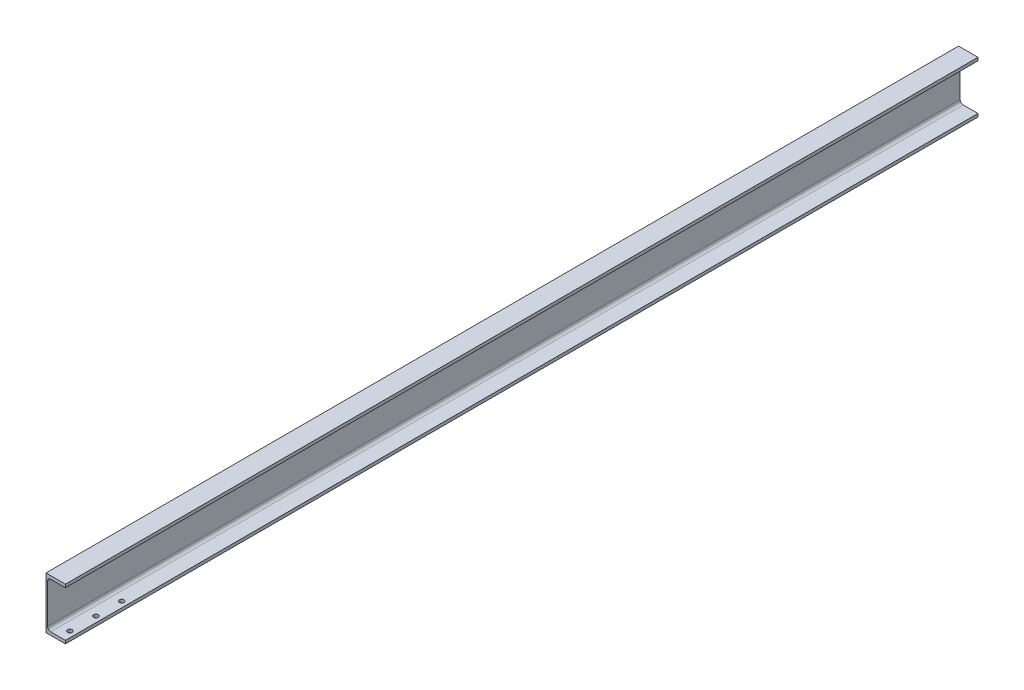
ISO-10303-21;
HEADER;
FILE_DESCRIPTION(('STEP AP214'),'2;1');
FILE_NAME('part.step','',(''),(''),'','','');
FILE_SCHEMA(('AUTOMOTIVE_DESIGN { 1 0 10303 214 1 1 1 1 }'));
ENDSEC;
DATA;
#1=APPLICATION_CONTEXT('core data for automotive mechanical design processes');
#2=APPLICATION_PROTOCOL_DEFINITION('international standard','automotive_design',2000,#1);
#3=PRODUCT_CONTEXT('',#1,'mechanical');
#4=PRODUCT('Part','Part','',(#3));
#5=PRODUCT_RELATED_PRODUCT_CATEGORY('part','',(#4));
#6=PRODUCT_DEFINITION_FORMATION('','',#4);
#7=PRODUCT_DEFINITION_CONTEXT('part definition',#1,'design');
#8=PRODUCT_DEFINITION('design','',#6,#7);
#9=PRODUCT_DEFINITION_SHAPE('','',#8);
#10=(LENGTH_UNIT() NAMED_UNIT(*) SI_UNIT(.MILLI.,.METRE.));
#11=(NAMED_UNIT(*) PLANE_ANGLE_UNIT() SI_UNIT($,.RADIAN.));
#12=(NAMED_UNIT(*) SI_UNIT($,.STERADIAN.) SOLID_ANGLE_UNIT());
#13=UNCERTAINTY_MEASURE_WITH_UNIT(LENGTH_MEASURE(1.E-05),#10,'distance_accuracy_value','');
#14=(GEOMETRIC_REPRESENTATION_CONTEXT(3) GLOBAL_UNCERTAINTY_ASSIGNED_CONTEXT((#13)) GLOBAL_UNIT_ASSIGNED_CONTEXT((#10,
#11,#12)) REPRESENTATION_CONTEXT('',''));
#15=CARTESIAN_POINT('',(0.,0.,0.));
#16=DIRECTION('',(0.,0.,1.));
#17=DIRECTION('',(1.,0.,0.));
#18=AXIS2_PLACEMENT_3D('',#15,#16,#17);
#19=CARTESIAN_POINT('',(0.,-100.,1762.5));
#20=DIRECTION('',(0.,1.,0.));
#21=DIRECTION('',(0.,0.,1.));
#22=AXIS2_PLACEMENT_3D('',#19,#20,#21);
#23=PLANE('',#22);
#24=CARTESIAN_POINT('',(52.5,-100.,1522.5));
#25=DIRECTION('',(0.,-1.,0.));
#26=DIRECTION('',(0.,0.,-1.));
#27=AXIS2_PLACEMENT_3D('',#24,#25,#26);
#28=CIRCLE('',#27,9.00000000000001);
#29=CARTESIAN_POINT('',(52.5,-100.,1513.5));
#30=VERTEX_POINT('',#29);
#31=EDGE_CURVE('E222',#30,#30,#28,.T.);
#32=ORIENTED_EDGE('',*,*,#31,.F.);
#33=EDGE_LOOP('',(#32));
#34=FACE_BOUND('',#33,.T.);
#35=CARTESIAN_POINT('',(52.5,-100.,1622.5));
#36=DIRECTION('',(0.,-1.,0.));
#37=DIRECTION('',(0.,0.,-1.));
#38=AXIS2_PLACEMENT_3D('',#35,#36,#37);
#39=CIRCLE('',#38,9.00000000000001);
#40=CARTESIAN_POINT('',(52.5,-100.,1613.5));
#41=VERTEX_POINT('',#40);
#42=EDGE_CURVE('E216',#41,#41,#39,.T.);
#43=ORIENTED_EDGE('',*,*,#42,.F.);
#44=EDGE_LOOP('',(#43));
#45=FACE_BOUND('',#44,.T.);
#46=CARTESIAN_POINT('',(52.5,-100.,1722.5));
#47=DIRECTION('',(0.,-1.,0.));
#48=DIRECTION('',(0.,0.,-1.));
#49=AXIS2_PLACEMENT_3D('',#46,#47,#48);
#50=CIRCLE('',#49,9.00000000000002);
#51=CARTESIAN_POINT('',(52.5,-100.,1713.5));
#52=VERTEX_POINT('',#51);
#53=EDGE_CURVE('E210',#52,#52,#50,.T.);
#54=ORIENTED_EDGE('',*,*,#53,.F.);
#55=EDGE_LOOP('',(#54));
#56=FACE_BOUND('',#55,.T.);
#57=DIRECTION('',(1.,0.,0.));
#58=VECTOR('',#57,1.);
#59=CARTESIAN_POINT('',(0.,-100.,-1762.5));
#60=LINE('',#59,#58);
#61=CARTESIAN_POINT('',(0.,-100.,-1762.5));
#62=VERTEX_POINT('',#61);
#63=CARTESIAN_POINT('',(75.,-100.,-1762.5));
#64=VERTEX_POINT('',#63);
#65=EDGE_CURVE('E144',#62,#64,#60,.T.);
#66=ORIENTED_EDGE('',*,*,#65,.T.);
#67=DIRECTION('',(0.,0.,-1.));
#68=VECTOR('',#67,1.);
#69=CARTESIAN_POINT('',(75.,-100.,1762.5));
#70=LINE('',#69,#68);
#71=CARTESIAN_POINT('',(75.,-100.,1762.5));
#72=VERTEX_POINT('',#71);
#73=EDGE_CURVE('E11',#72,#64,#70,.T.);
#74=ORIENTED_EDGE('',*,*,#73,.F.);
#75=DIRECTION('',(1.,0.,0.));
#76=VECTOR('',#75,1.);
#77=CARTESIAN_POINT('',(0.,-100.,1762.5));
#78=LINE('',#77,#76);
#79=CARTESIAN_POINT('',(0.,-100.,1762.5));
#80=VERTEX_POINT('',#79);
#81=EDGE_CURVE('E163',#80,#72,#78,.T.);
#82=ORIENTED_EDGE('',*,*,#81,.F.);
#83=DIRECTION('',(0.,0.,-1.));
#84=VECTOR('',#83,1.);
#85=CARTESIAN_POINT('',(0.,-100.,1762.5));
#86=LINE('',#85,#84);
#87=EDGE_CURVE('E140',#80,#62,#86,.T.);
#88=ORIENTED_EDGE('',*,*,#87,.T.);
#89=EDGE_LOOP('',(#66,#74,#82,#88));
#90=FACE_BOUND('',#89,.T.);
#91=ADVANCED_FACE('F36',(#34,#45,#56,#90),#23,.F.);
#92=CARTESIAN_POINT('',(75.,-100.,1762.5));
#93=DIRECTION('',(-1.,0.,0.));
#94=DIRECTION('',(0.,0.,1.));
#95=AXIS2_PLACEMENT_3D('',#92,#93,#94);
#96=PLANE('',#95);
#97=DIRECTION('',(0.,1.,0.));
#98=VECTOR('',#97,1.);
#99=CARTESIAN_POINT('',(75.,-100.,-1762.5));
#100=LINE('',#99,#98);
#101=CARTESIAN_POINT('',(75.,-88.,-1762.5));
#102=VERTEX_POINT('',#101);
#103=EDGE_CURVE('E147',#64,#102,#100,.T.);
#104=ORIENTED_EDGE('',*,*,#103,.T.);
#105=DIRECTION('',(0.,0.,-1.));
#106=VECTOR('',#105,1.);
#107=CARTESIAN_POINT('',(75.,-88.,1762.5));
#108=LINE('',#107,#106);
#109=CARTESIAN_POINT('',(75.,-88.,1762.5));
#110=VERTEX_POINT('',#109);
#111=EDGE_CURVE('E44',#110,#102,#108,.T.);
#112=ORIENTED_EDGE('',*,*,#111,.F.);
#113=DIRECTION('',(0.,1.,0.));
#114=VECTOR('',#113,1.);
#115=CARTESIAN_POINT('',(75.,-100.,1762.5));
#116=LINE('',#115,#114);
#117=EDGE_CURVE('E101',#72,#110,#116,.T.);
#118=ORIENTED_EDGE('',*,*,#117,.F.);
#119=ORIENTED_EDGE('',*,*,#73,.T.);
#120=EDGE_LOOP('',(#104,#112,#118,#119));
#121=FACE_BOUND('',#120,.T.);
#122=ADVANCED_FACE('F232',(#121),#96,.F.);
#123=CARTESIAN_POINT('',(75.,-88.,1762.5));
#124=DIRECTION('',(0.,-1.,0.));
#125=DIRECTION('',(1.,0.,0.));
#126=AXIS2_PLACEMENT_3D('',#123,#124,#125);
#127=PLANE('',#126);
#128=CARTESIAN_POINT('',(52.5,-88.,1522.5));
#129=DIRECTION('',(0.,-1.,0.));
#130=DIRECTION('',(1.,0.,0.));
#131=AXIS2_PLACEMENT_3D('',#128,#129,#130);
#132=CIRCLE('',#131,9.00000000000001);
#133=CARTESIAN_POINT('',(52.5,-88.,1513.5));
#134=VERTEX_POINT('',#133);
#135=EDGE_CURVE('E219',#134,#134,#132,.F.);
#136=ORIENTED_EDGE('',*,*,#135,.F.);
#137=EDGE_LOOP('',(#136));
#138=FACE_BOUND('',#137,.T.);
#139=CARTESIAN_POINT('',(52.5,-88.,1622.5));
#140=DIRECTION('',(0.,-1.,0.));
#141=DIRECTION('',(1.,0.,0.));
#142=AXIS2_PLACEMENT_3D('',#139,#140,#141);
#143=CIRCLE('',#142,9.00000000000001);
#144=CARTESIAN_POINT('',(52.5,-88.,1613.5));
#145=VERTEX_POINT('',#144);
#146=EDGE_CURVE('E213',#145,#145,#143,.F.);
#147=ORIENTED_EDGE('',*,*,#146,.F.);
#148=EDGE_LOOP('',(#147));
#149=FACE_BOUND('',#148,.T.);
#150=CARTESIAN_POINT('',(52.5,-88.,1722.5));
#151=DIRECTION('',(0.,-1.,0.));
#152=DIRECTION('',(1.,0.,0.));
#153=AXIS2_PLACEMENT_3D('',#150,#151,#152);
#154=CIRCLE('',#153,9.00000000000002);
#155=CARTESIAN_POINT('',(52.5,-88.,1713.5));
#156=VERTEX_POINT('',#155);
#157=EDGE_CURVE('E148',#156,#156,#154,.F.);
#158=ORIENTED_EDGE('',*,*,#157,.F.);
#159=EDGE_LOOP('',(#158));
#160=FACE_BOUND('',#159,.T.);
#161=DIRECTION('',(-1.,0.,0.));
#162=VECTOR('',#161,1.);
#163=CARTESIAN_POINT('',(75.,-88.,-1762.5));
#164=LINE('',#163,#162);
#165=CARTESIAN_POINT('',(18.0000000000001,-88.,-1762.5));
#166=VERTEX_POINT('',#165);
#167=EDGE_CURVE('E150',#102,#166,#164,.T.);
#168=ORIENTED_EDGE('',*,*,#167,.T.);
#169=DIRECTION('',(0.,0.,-1.));
#170=VECTOR('',#169,1.);
#171=CARTESIAN_POINT('',(18.0000000000001,-88.,1762.5));
#172=LINE('',#171,#170);
#173=CARTESIAN_POINT('',(18.0000000000001,-88.,1762.5));
#174=VERTEX_POINT('',#173);
#175=EDGE_CURVE('E176',#174,#166,#172,.T.);
#176=ORIENTED_EDGE('',*,*,#175,.F.);
#177=DIRECTION('',(-1.,0.,0.));
#178=VECTOR('',#177,1.);
#179=CARTESIAN_POINT('',(75.,-88.,1762.5));
#180=LINE('',#179,#178);
#181=EDGE_CURVE('E184',#110,#174,#180,.T.);
#182=ORIENTED_EDGE('',*,*,#181,.F.);
#183=ORIENTED_EDGE('',*,*,#111,.T.);
#184=EDGE_LOOP('',(#168,#176,#182,#183));
#185=FACE_BOUND('',#184,.T.);
#186=ADVANCED_FACE('F182',(#138,#149,#160,#185),#127,.F.);
#187=CARTESIAN_POINT('',(18.,-76.,1762.5));
#188=DIRECTION('',(0.,0.,-1.));
#189=DIRECTION('',(-1.,0.,0.));
#190=AXIS2_PLACEMENT_3D('',#187,#188,#189);
#191=CYLINDRICAL_SURFACE('',#190,12.);
#192=CARTESIAN_POINT('',(18.,-76.,-1762.5));
#193=DIRECTION('',(0.,0.,-1.));
#194=DIRECTION('',(-1.,0.,0.));
#195=AXIS2_PLACEMENT_3D('',#192,#193,#194);
#196=CIRCLE('',#195,12.);
#197=CARTESIAN_POINT('',(6.00000000000001,-75.9999999999999,-1762.5));
#198=VERTEX_POINT('',#197);
#199=EDGE_CURVE('E152',#166,#198,#196,.T.);
#200=ORIENTED_EDGE('',*,*,#199,.T.);
#201=DIRECTION('',(0.,0.,-1.));
#202=VECTOR('',#201,1.);
#203=CARTESIAN_POINT('',(6.00000000000001,-75.9999999999999,1762.5));
#204=LINE('',#203,#202);
#205=CARTESIAN_POINT('',(6.00000000000001,-75.9999999999999,1762.5));
#206=VERTEX_POINT('',#205);
#207=EDGE_CURVE('E173',#206,#198,#204,.T.);
#208=ORIENTED_EDGE('',*,*,#207,.F.);
#209=CARTESIAN_POINT('',(18.,-76.,1762.5));
#210=DIRECTION('',(0.,0.,-1.));
#211=DIRECTION('',(-1.,0.,0.));
#212=AXIS2_PLACEMENT_3D('',#209,#210,#211);
#213=CIRCLE('',#212,12.);
#214=EDGE_CURVE('E202',#174,#206,#213,.T.);
#215=ORIENTED_EDGE('',*,*,#214,.F.);
#216=ORIENTED_EDGE('',*,*,#175,.T.);
#217=EDGE_LOOP('',(#200,#208,#215,#216));
#218=FACE_BOUND('',#217,.T.);
#219=ADVANCED_FACE('F193',(#218),#191,.F.);
#220=CARTESIAN_POINT('',(6.00000000000001,-75.9999999999999,1762.5));
#221=DIRECTION('',(-1.,0.,0.));
#222=DIRECTION('',(0.,0.,1.));
#223=AXIS2_PLACEMENT_3D('',#220,#221,#222);
#224=PLANE('',#223);
#225=DIRECTION('',(0.,1.,0.));
#226=VECTOR('',#225,1.);
#227=CARTESIAN_POINT('',(6.00000000000001,-75.9999999999999,-1762.5));
#228=LINE('',#227,#226);
#229=CARTESIAN_POINT('',(6.00000000000001,75.9999999999999,-1762.5));
#230=VERTEX_POINT('',#229);
#231=EDGE_CURVE('E154',#198,#230,#228,.T.);
#232=ORIENTED_EDGE('',*,*,#231,.T.);
#233=DIRECTION('',(0.,0.,-1.));
#234=VECTOR('',#233,1.);
#235=CARTESIAN_POINT('',(6.00000000000001,75.9999999999999,1762.5));
#236=LINE('',#235,#234);
#237=CARTESIAN_POINT('',(6.00000000000001,75.9999999999999,1762.5));
#238=VERTEX_POINT('',#237);
#239=EDGE_CURVE('E170',#238,#230,#236,.T.);
#240=ORIENTED_EDGE('',*,*,#239,.F.);
#241=DIRECTION('',(0.,1.,0.));
#242=VECTOR('',#241,1.);
#243=CARTESIAN_POINT('',(6.00000000000001,-75.9999999999999,1762.5));
#244=LINE('',#243,#242);
#245=EDGE_CURVE('E199',#206,#238,#244,.T.);
#246=ORIENTED_EDGE('',*,*,#245,.F.);
#247=ORIENTED_EDGE('',*,*,#207,.T.);
#248=EDGE_LOOP('',(#232,#240,#246,#247));
#249=FACE_BOUND('',#248,.T.);
#250=ADVANCED_FACE('F197',(#249),#224,.F.);
#251=CARTESIAN_POINT('',(18.,76.,1762.5));
#252=DIRECTION('',(0.,0.,-1.));
#253=DIRECTION('',(-1.,0.,0.));
#254=AXIS2_PLACEMENT_3D('',#251,#252,#253);
#255=CYLINDRICAL_SURFACE('',#254,12.);
#256=CARTESIAN_POINT('',(18.,76.,-1762.5));
#257=DIRECTION('',(0.,0.,-1.));
#258=DIRECTION('',(1.,0.,0.));
#259=AXIS2_PLACEMENT_3D('',#256,#257,#258);
#260=CIRCLE('',#259,12.);
#261=CARTESIAN_POINT('',(18.0000000000001,88.,-1762.5));
#262=VERTEX_POINT('',#261);
#263=EDGE_CURVE('E156',#230,#262,#260,.T.);
#264=ORIENTED_EDGE('',*,*,#263,.T.);
#265=DIRECTION('',(0.,0.,-1.));
#266=VECTOR('',#265,1.);
#267=CARTESIAN_POINT('',(18.0000000000001,88.,1762.5));
#268=LINE('',#267,#266);
#269=CARTESIAN_POINT('',(18.0000000000001,88.,1762.5));
#270=VERTEX_POINT('',#269);
#271=EDGE_CURVE('E167',#270,#262,#268,.T.);
#272=ORIENTED_EDGE('',*,*,#271,.F.);
#273=CARTESIAN_POINT('',(18.,76.,1762.5));
#274=DIRECTION('',(0.,0.,-1.));
#275=DIRECTION('',(1.,0.,0.));
#276=AXIS2_PLACEMENT_3D('',#273,#274,#275);
#277=CIRCLE('',#276,12.);
#278=EDGE_CURVE('E201',#238,#270,#277,.T.);
#279=ORIENTED_EDGE('',*,*,#278,.F.);
#280=ORIENTED_EDGE('',*,*,#239,.T.);
#281=EDGE_LOOP('',(#264,#272,#279,#280));
#282=FACE_BOUND('',#281,.T.);
#283=ADVANCED_FACE('F270',(#282),#255,.F.);
#284=CARTESIAN_POINT('',(75.,88.,1762.5));
#285=DIRECTION('',(0.,1.,0.));
#286=DIRECTION('',(-1.,0.,0.));
#287=AXIS2_PLACEMENT_3D('',#284,#285,#286);
#288=PLANE('',#287);
#289=DIRECTION('',(1.,0.,0.));
#290=VECTOR('',#289,1.);
#291=CARTESIAN_POINT('',(75.,88.,-1762.5));
#292=LINE('',#291,#290);
#293=CARTESIAN_POINT('',(75.,88.,-1762.5));
#294=VERTEX_POINT('',#293);
#295=EDGE_CURVE('E158',#262,#294,#292,.T.);
#296=ORIENTED_EDGE('',*,*,#295,.T.);
#297=DIRECTION('',(0.,0.,-1.));
#298=VECTOR('',#297,1.);
#299=CARTESIAN_POINT('',(75.,88.,1762.5));
#300=LINE('',#299,#298);
#301=CARTESIAN_POINT('',(75.,88.,1762.5));
#302=VERTEX_POINT('',#301);
#303=EDGE_CURVE('E135',#302,#294,#300,.T.);
#304=ORIENTED_EDGE('',*,*,#303,.F.);
#305=DIRECTION('',(1.,0.,0.));
#306=VECTOR('',#305,1.);
#307=CARTESIAN_POINT('',(75.,88.,1762.5));
#308=LINE('',#307,#306);
#309=EDGE_CURVE('E126',#270,#302,#308,.T.);
#310=ORIENTED_EDGE('',*,*,#309,.F.);
#311=ORIENTED_EDGE('',*,*,#271,.T.);
#312=EDGE_LOOP('',(#296,#304,#310,#311));
#313=FACE_BOUND('',#312,.T.);
#314=ADVANCED_FACE('F267',(#313),#288,.F.);
#315=CARTESIAN_POINT('',(75.,100.,1762.5));
#316=DIRECTION('',(-1.,0.,0.));
#317=DIRECTION('',(0.,0.,1.));
#318=AXIS2_PLACEMENT_3D('',#315,#316,#317);
#319=PLANE('',#318);
#320=DIRECTION('',(0.,1.,0.));
#321=VECTOR('',#320,1.);
#322=CARTESIAN_POINT('',(75.,100.,-1762.5));
#323=LINE('',#322,#321);
#324=CARTESIAN_POINT('',(75.,100.,-1762.5));
#325=VERTEX_POINT('',#324);
#326=EDGE_CURVE('E134',#294,#325,#323,.T.);
#327=ORIENTED_EDGE('',*,*,#326,.T.);
#328=DIRECTION('',(0.,0.,-1.));
#329=VECTOR('',#328,1.);
#330=CARTESIAN_POINT('',(75.,100.,1762.5));
#331=LINE('',#330,#329);
#332=CARTESIAN_POINT('',(75.,100.,1762.5));
#333=VERTEX_POINT('',#332);
#334=EDGE_CURVE('E131',#333,#325,#331,.T.);
#335=ORIENTED_EDGE('',*,*,#334,.F.);
#336=DIRECTION('',(0.,1.,0.));
#337=VECTOR('',#336,1.);
#338=CARTESIAN_POINT('',(75.,100.,1762.5));
#339=LINE('',#338,#337);
#340=EDGE_CURVE('E120',#302,#333,#339,.T.);
#341=ORIENTED_EDGE('',*,*,#340,.F.);
#342=ORIENTED_EDGE('',*,*,#303,.T.);
#343=EDGE_LOOP('',(#327,#335,#341,#342));
#344=FACE_BOUND('',#343,.T.);
#345=ADVANCED_FACE('F132',(#344),#319,.F.);
#346=CARTESIAN_POINT('',(0.,100.,1762.5));
#347=DIRECTION('',(0.,-1.,0.));
#348=DIRECTION('',(0.,0.,-1.));
#349=AXIS2_PLACEMENT_3D('',#346,#347,#348);
#350=PLANE('',#349);
#351=DIRECTION('',(-1.,0.,0.));
#352=VECTOR('',#351,1.);
#353=CARTESIAN_POINT('',(0.,100.,-1762.5));
#354=LINE('',#353,#352);
#355=CARTESIAN_POINT('',(0.,100.,-1762.5));
#356=VERTEX_POINT('',#355);
#357=EDGE_CURVE('E87',#325,#356,#354,.T.);
#358=ORIENTED_EDGE('',*,*,#357,.T.);
#359=DIRECTION('',(0.,0.,-1.));
#360=VECTOR('',#359,1.);
#361=CARTESIAN_POINT('',(0.,100.,1762.5));
#362=LINE('',#361,#360);
#363=CARTESIAN_POINT('',(0.,100.,1762.5));
#364=VERTEX_POINT('',#363);
#365=EDGE_CURVE('E136',#364,#356,#362,.T.);
#366=ORIENTED_EDGE('',*,*,#365,.F.);
#367=DIRECTION('',(-1.,0.,0.));
#368=VECTOR('',#367,1.);
#369=CARTESIAN_POINT('',(0.,100.,1762.5));
#370=LINE('',#369,#368);
#371=EDGE_CURVE('E124',#333,#364,#370,.T.);
#372=ORIENTED_EDGE('',*,*,#371,.F.);
#373=ORIENTED_EDGE('',*,*,#334,.T.);
#374=EDGE_LOOP('',(#358,#366,#372,#373));
#375=FACE_BOUND('',#374,.T.);
#376=ADVANCED_FACE('F138',(#375),#350,.F.);
#377=CARTESIAN_POINT('',(0.,100.,1762.5));
#378=DIRECTION('',(1.,0.,0.));
#379=DIRECTION('',(0.,0.,-1.));
#380=AXIS2_PLACEMENT_3D('',#377,#378,#379);
#381=PLANE('',#380);
#382=DIRECTION('',(0.,-1.,0.));
#383=VECTOR('',#382,1.);
#384=CARTESIAN_POINT('',(0.,100.,-1762.5));
#385=LINE('',#384,#383);
#386=EDGE_CURVE('E93',#356,#62,#385,.T.);
#387=ORIENTED_EDGE('',*,*,#386,.T.);
#388=ORIENTED_EDGE('',*,*,#87,.F.);
#389=DIRECTION('',(0.,-1.,0.));
#390=VECTOR('',#389,1.);
#391=CARTESIAN_POINT('',(0.,100.,1762.5));
#392=LINE('',#391,#390);
#393=EDGE_CURVE('E52',#364,#80,#392,.T.);
#394=ORIENTED_EDGE('',*,*,#393,.F.);
#395=ORIENTED_EDGE('',*,*,#365,.T.);
#396=EDGE_LOOP('',(#387,#388,#394,#395));
#397=FACE_BOUND('',#396,.T.);
#398=ADVANCED_FACE('F318',(#397),#381,.F.);
#399=CARTESIAN_POINT('',(18.,-76.,1762.5));
#400=DIRECTION('',(0.,0.,-1.));
#401=DIRECTION('',(-1.,0.,0.));
#402=AXIS2_PLACEMENT_3D('',#399,#400,#401);
#403=PLANE('',#402);
#404=ORIENTED_EDGE('',*,*,#81,.T.);
#405=ORIENTED_EDGE('',*,*,#117,.T.);
#406=ORIENTED_EDGE('',*,*,#181,.T.);
#407=ORIENTED_EDGE('',*,*,#214,.T.);
#408=ORIENTED_EDGE('',*,*,#245,.T.);
#409=ORIENTED_EDGE('',*,*,#278,.T.);
#410=ORIENTED_EDGE('',*,*,#309,.T.);
#411=ORIENTED_EDGE('',*,*,#340,.T.);
#412=ORIENTED_EDGE('',*,*,#371,.T.);
#413=ORIENTED_EDGE('',*,*,#393,.T.);
#414=EDGE_LOOP('',(#404,#405,#406,#407,#408,#409,#410,#411,#412,#413));
#415=FACE_BOUND('',#414,.T.);
#416=ADVANCED_FACE('F122',(#415),#403,.F.);
#417=CARTESIAN_POINT('',(18.,-76.,-1762.5));
#418=DIRECTION('',(0.,0.,-1.));
#419=DIRECTION('',(-1.,0.,0.));
#420=AXIS2_PLACEMENT_3D('',#417,#418,#419);
#421=PLANE('',#420);
#422=ORIENTED_EDGE('',*,*,#65,.F.);
#423=ORIENTED_EDGE('',*,*,#386,.F.);
#424=ORIENTED_EDGE('',*,*,#357,.F.);
#425=ORIENTED_EDGE('',*,*,#326,.F.);
#426=ORIENTED_EDGE('',*,*,#295,.F.);
#427=ORIENTED_EDGE('',*,*,#263,.F.);
#428=ORIENTED_EDGE('',*,*,#231,.F.);
#429=ORIENTED_EDGE('',*,*,#199,.F.);
#430=ORIENTED_EDGE('',*,*,#167,.F.);
#431=ORIENTED_EDGE('',*,*,#103,.F.);
#432=EDGE_LOOP('',(#422,#423,#424,#425,#426,#427,#428,#429,#430,#431));
#433=FACE_BOUND('',#432,.T.);
#434=ADVANCED_FACE('F188',(#433),#421,.T.);
#435=CARTESIAN_POINT('',(52.5,100.001,1722.5));
#436=DIRECTION('',(0.,-1.,0.));
#437=DIRECTION('',(0.,0.,-1.));
#438=AXIS2_PLACEMENT_3D('',#435,#436,#437);
#439=CYLINDRICAL_SURFACE('',#438,9.00000000000002);
#440=CARTESIAN_POINT('',(52.5,-100.,1713.5));
#441=CARTESIAN_POINT('',(52.5,-99.875,1713.5));
#442=CARTESIAN_POINT('',(52.5,-99.75,1713.5));
#443=CARTESIAN_POINT('',(52.5,-99.5,1713.5));
#444=CARTESIAN_POINT('',(52.5,-99.375,1713.5));
#445=CARTESIAN_POINT('',(52.5,-99.125,1713.5));
#446=CARTESIAN_POINT('',(52.5,-99.,1713.5));
#447=CARTESIAN_POINT('',(52.5,-98.75,1713.5));
#448=CARTESIAN_POINT('',(52.5,-98.625,1713.5));
#449=CARTESIAN_POINT('',(52.5,-98.375,1713.5));
#450=CARTESIAN_POINT('',(52.5,-98.25,1713.5));
#451=CARTESIAN_POINT('',(52.5,-98.,1713.5));
#452=CARTESIAN_POINT('',(52.5,-97.875,1713.5));
#453=CARTESIAN_POINT('',(52.5,-97.625,1713.5));
#454=CARTESIAN_POINT('',(52.5,-97.5,1713.5));
#455=CARTESIAN_POINT('',(52.5,-97.25,1713.5));
#456=CARTESIAN_POINT('',(52.5,-97.125,1713.5));
#457=CARTESIAN_POINT('',(52.5,-96.875,1713.5));
#458=CARTESIAN_POINT('',(52.5,-96.75,1713.5));
#459=CARTESIAN_POINT('',(52.5,-96.5,1713.5));
#460=CARTESIAN_POINT('',(52.5,-96.375,1713.5));
#461=CARTESIAN_POINT('',(52.5,-96.125,1713.5));
#462=CARTESIAN_POINT('',(52.5,-96.,1713.5));
#463=CARTESIAN_POINT('',(52.5,-95.75,1713.5));
#464=CARTESIAN_POINT('',(52.5,-95.625,1713.5));
#465=CARTESIAN_POINT('',(52.5,-95.375,1713.5));
#466=CARTESIAN_POINT('',(52.5,-95.25,1713.5));
#467=CARTESIAN_POINT('',(52.5,-95.,1713.5));
#468=CARTESIAN_POINT('',(52.5,-94.875,1713.5));
#469=CARTESIAN_POINT('',(52.5,-94.625,1713.5));
#470=CARTESIAN_POINT('',(52.5,-94.5,1713.5));
#471=CARTESIAN_POINT('',(52.5,-94.25,1713.5));
#472=CARTESIAN_POINT('',(52.5,-94.125,1713.5));
#473=CARTESIAN_POINT('',(52.5,-93.875,1713.5));
#474=CARTESIAN_POINT('',(52.5,-93.75,1713.5));
#475=CARTESIAN_POINT('',(52.5,-93.5,1713.5));
#476=CARTESIAN_POINT('',(52.5,-93.375,1713.5));
#477=CARTESIAN_POINT('',(52.5,-93.125,1713.5));
#478=CARTESIAN_POINT('',(52.5,-93.,1713.5));
#479=CARTESIAN_POINT('',(52.5,-92.75,1713.5));
#480=CARTESIAN_POINT('',(52.5,-92.625,1713.5));
#481=CARTESIAN_POINT('',(52.5,-92.375,1713.5));
#482=CARTESIAN_POINT('',(52.5,-92.25,1713.5));
#483=CARTESIAN_POINT('',(52.5,-92.,1713.5));
#484=CARTESIAN_POINT('',(52.5,-91.875,1713.5));
#485=CARTESIAN_POINT('',(52.5,-91.625,1713.5));
#486=CARTESIAN_POINT('',(52.5,-91.5,1713.5));
#487=CARTESIAN_POINT('',(52.5,-91.25,1713.5));
#488=CARTESIAN_POINT('',(52.5,-91.125,1713.5));
#489=CARTESIAN_POINT('',(52.5,-90.875,1713.5));
#490=CARTESIAN_POINT('',(52.5,-90.75,1713.5));
#491=CARTESIAN_POINT('',(52.5,-90.5,1713.5));
#492=CARTESIAN_POINT('',(52.5,-90.375,1713.5));
#493=CARTESIAN_POINT('',(52.5,-90.125,1713.5));
#494=CARTESIAN_POINT('',(52.5,-90.,1713.5));
#495=CARTESIAN_POINT('',(52.5,-89.75,1713.5));
#496=CARTESIAN_POINT('',(52.5,-89.625,1713.5));
#497=CARTESIAN_POINT('',(52.5,-89.375,1713.5));
#498=CARTESIAN_POINT('',(52.5,-89.25,1713.5));
#499=CARTESIAN_POINT('',(52.5,-89.,1713.5));
#500=CARTESIAN_POINT('',(52.5,-88.875,1713.5));
#501=CARTESIAN_POINT('',(52.5,-88.625,1713.5));
#502=CARTESIAN_POINT('',(52.5,-88.5,1713.5));
#503=CARTESIAN_POINT('',(52.5,-88.25,1713.5));
#504=CARTESIAN_POINT('',(52.5,-88.125,1713.5));
#505=CARTESIAN_POINT('',(52.5,-88.,1713.5));
#506=B_SPLINE_CURVE_WITH_KNOTS('',3,(#440,#441,#442,#443,#444,#445,#446,#447,#448,#449,#450,
#451,#452,#453,#454,#455,#456,#457,#458,#459,#460,#461,#462,#463,#464,#465,#466,#467,#468,#469,
#470,#471,#472,#473,#474,#475,#476,#477,#478,#479,#480,#481,#482,#483,#484,#485,#486,#487,#488,
#489,#490,#491,#492,#493,#494,#495,#496,#497,#498,#499,#500,#501,#502,#503,#504,#505),
.UNSPECIFIED.,.F.,.F.,(4,2,2,2,2,2,2,2,2,2,2,2,2,2,2,2,2,2,2,2,2,2,2,2,2,2,2,2,2,2,2,2,4),(0.,
0.375000000000014,0.750000000000001,1.12499999999999,1.5,1.87500000000002,2.25,2.62499999999999,
3.,3.37500000000002,3.75,4.12499999999999,4.5,4.87500000000002,5.25,5.62499999999999,
6.00000000000001,6.37500000000002,6.75000000000001,7.12499999999999,7.50000000000001,
7.87500000000002,8.25000000000001,8.62499999999999,9.00000000000001,9.37500000000002,
9.75000000000001,10.125,10.5,10.875,11.25,11.625,12.),.UNSPECIFIED.);
#507=EDGE_CURVE('BSEAM238',#52,#156,#506,.T.);
#508=ORIENTED_EDGE('',*,*,#53,.T.);
#509=ORIENTED_EDGE('',*,*,#157,.T.);
#510=ORIENTED_EDGE('',*,*,#507,.T.);
#511=ORIENTED_EDGE('',*,*,#507,.F.);
#512=EDGE_LOOP('',(#508,#510,#509,#511));
#513=FACE_BOUND('',#512,.T.);
#514=ADVANCED_FACE('F238',(#513),#439,.F.);
#515=CARTESIAN_POINT('',(52.5,100.001,1622.5));
#516=DIRECTION('',(0.,-1.,0.));
#517=DIRECTION('',(0.,0.,-1.));
#518=AXIS2_PLACEMENT_3D('',#515,#516,#517);
#519=CYLINDRICAL_SURFACE('',#518,9.00000000000001);
#520=CARTESIAN_POINT('',(52.5,-100.,1613.5));
#521=CARTESIAN_POINT('',(52.5,-99.875,1613.5));
#522=CARTESIAN_POINT('',(52.5,-99.75,1613.5));
#523=CARTESIAN_POINT('',(52.5,-99.5,1613.5));
#524=CARTESIAN_POINT('',(52.5,-99.375,1613.5));
#525=CARTESIAN_POINT('',(52.5,-99.125,1613.5));
#526=CARTESIAN_POINT('',(52.5,-99.,1613.5));
#527=CARTESIAN_POINT('',(52.5,-98.75,1613.5));
#528=CARTESIAN_POINT('',(52.5,-98.625,1613.5));
#529=CARTESIAN_POINT('',(52.5,-98.375,1613.5));
#530=CARTESIAN_POINT('',(52.5,-98.25,1613.5));
#531=CARTESIAN_POINT('',(52.5,-98.,1613.5));
#532=CARTESIAN_POINT('',(52.5,-97.875,1613.5));
#533=CARTESIAN_POINT('',(52.5,-97.625,1613.5));
#534=CARTESIAN_POINT('',(52.5,-97.5,1613.5));
#535=CARTESIAN_POINT('',(52.5,-97.25,1613.5));
#536=CARTESIAN_POINT('',(52.5,-97.125,1613.5));
#537=CARTESIAN_POINT('',(52.5,-96.875,1613.5));
#538=CARTESIAN_POINT('',(52.5,-96.75,1613.5));
#539=CARTESIAN_POINT('',(52.5,-96.5,1613.5));
#540=CARTESIAN_POINT('',(52.5,-96.375,1613.5));
#541=CARTESIAN_POINT('',(52.5,-96.125,1613.5));
#542=CARTESIAN_POINT('',(52.5,-96.,1613.5));
#543=CARTESIAN_POINT('',(52.5,-95.75,1613.5));
#544=CARTESIAN_POINT('',(52.5,-95.625,1613.5));
#545=CARTESIAN_POINT('',(52.5,-95.375,1613.5));
#546=CARTESIAN_POINT('',(52.5,-95.25,1613.5));
#547=CARTESIAN_POINT('',(52.5,-95.,1613.5));
#548=CARTESIAN_POINT('',(52.5,-94.875,1613.5));
#549=CARTESIAN_POINT('',(52.5,-94.625,1613.5));
#550=CARTESIAN_POINT('',(52.5,-94.5,1613.5));
#551=CARTESIAN_POINT('',(52.5,-94.25,1613.5));
#552=CARTESIAN_POINT('',(52.5,-94.125,1613.5));
#553=CARTESIAN_POINT('',(52.5,-93.875,1613.5));
#554=CARTESIAN_POINT('',(52.5,-93.75,1613.5));
#555=CARTESIAN_POINT('',(52.5,-93.5,1613.5));
#556=CARTESIAN_POINT('',(52.5,-93.375,1613.5));
#557=CARTESIAN_POINT('',(52.5,-93.125,1613.5));
#558=CARTESIAN_POINT('',(52.5,-93.,1613.5));
#559=CARTESIAN_POINT('',(52.5,-92.75,1613.5));
#560=CARTESIAN_POINT('',(52.5,-92.625,1613.5));
#561=CARTESIAN_POINT('',(52.5,-92.375,1613.5));
#562=CARTESIAN_POINT('',(52.5,-92.25,1613.5));
#563=CARTESIAN_POINT('',(52.5,-92.,1613.5));
#564=CARTESIAN_POINT('',(52.5,-91.875,1613.5));
#565=CARTESIAN_POINT('',(52.5,-91.625,1613.5));
#566=CARTESIAN_POINT('',(52.5,-91.5,1613.5));
#567=CARTESIAN_POINT('',(52.5,-91.25,1613.5));
#568=CARTESIAN_POINT('',(52.5,-91.125,1613.5));
#569=CARTESIAN_POINT('',(52.5,-90.875,1613.5));
#570=CARTESIAN_POINT('',(52.5,-90.75,1613.5));
#571=CARTESIAN_POINT('',(52.5,-90.5,1613.5));
#572=CARTESIAN_POINT('',(52.5,-90.375,1613.5));
#573=CARTESIAN_POINT('',(52.5,-90.125,1613.5));
#574=CARTESIAN_POINT('',(52.5,-90.,1613.5));
#575=CARTESIAN_POINT('',(52.5,-89.75,1613.5));
#576=CARTESIAN_POINT('',(52.5,-89.625,1613.5));
#577=CARTESIAN_POINT('',(52.5,-89.375,1613.5));
#578=CARTESIAN_POINT('',(52.5,-89.25,1613.5));
#579=CARTESIAN_POINT('',(52.5,-89.,1613.5));
#580=CARTESIAN_POINT('',(52.5,-88.875,1613.5));
#581=CARTESIAN_POINT('',(52.5,-88.625,1613.5));
#582=CARTESIAN_POINT('',(52.5,-88.5,1613.5));
#583=CARTESIAN_POINT('',(52.5,-88.25,1613.5));
#584=CARTESIAN_POINT('',(52.5,-88.125,1613.5));
#585=CARTESIAN_POINT('',(52.5,-88.,1613.5));
#586=B_SPLINE_CURVE_WITH_KNOTS('',3,(#520,#521,#522,#523,#524,#525,#526,#527,#528,#529,#530,
#531,#532,#533,#534,#535,#536,#537,#538,#539,#540,#541,#542,#543,#544,#545,#546,#547,#548,#549,
#550,#551,#552,#553,#554,#555,#556,#557,#558,#559,#560,#561,#562,#563,#564,#565,#566,#567,#568,
#569,#570,#571,#572,#573,#574,#575,#576,#577,#578,#579,#580,#581,#582,#583,#584,#585),
.UNSPECIFIED.,.F.,.F.,(4,2,2,2,2,2,2,2,2,2,2,2,2,2,2,2,2,2,2,2,2,2,2,2,2,2,2,2,2,2,2,2,4),(0.,
0.375000000000014,0.750000000000001,1.12499999999999,1.5,1.87500000000002,2.25,2.62499999999999,
3.,3.37500000000002,3.75,4.12499999999999,4.5,4.87500000000002,5.25,5.62499999999999,
6.00000000000001,6.37500000000002,6.75000000000001,7.12499999999999,7.50000000000001,
7.87500000000002,8.25000000000001,8.62499999999999,9.00000000000001,9.37500000000002,
9.75000000000001,10.125,10.5,10.875,11.25,11.625,12.),.UNSPECIFIED.);
#587=EDGE_CURVE('BSEAM240',#41,#145,#586,.T.);
#588=ORIENTED_EDGE('',*,*,#42,.T.);
#589=ORIENTED_EDGE('',*,*,#146,.T.);
#590=ORIENTED_EDGE('',*,*,#587,.T.);
#591=ORIENTED_EDGE('',*,*,#587,.F.);
#592=EDGE_LOOP('',(#588,#590,#589,#591));
#593=FACE_BOUND('',#592,.T.);
#594=ADVANCED_FACE('F240',(#593),#519,.F.);
#595=CARTESIAN_POINT('',(52.5,100.001,1522.5));
#596=DIRECTION('',(0.,-1.,0.));
#597=DIRECTION('',(0.,0.,-1.));
#598=AXIS2_PLACEMENT_3D('',#595,#596,#597);
#599=CYLINDRICAL_SURFACE('',#598,9.00000000000001);
#600=CARTESIAN_POINT('',(52.5,-100.,1513.5));
#601=CARTESIAN_POINT('',(52.5,-99.875,1513.5));
#602=CARTESIAN_POINT('',(52.5,-99.75,1513.5));
#603=CARTESIAN_POINT('',(52.5,-99.5,1513.5));
#604=CARTESIAN_POINT('',(52.5,-99.375,1513.5));
#605=CARTESIAN_POINT('',(52.5,-99.125,1513.5));
#606=CARTESIAN_POINT('',(52.5,-99.,1513.5));
#607=CARTESIAN_POINT('',(52.5,-98.75,1513.5));
#608=CARTESIAN_POINT('',(52.5,-98.625,1513.5));
#609=CARTESIAN_POINT('',(52.5,-98.375,1513.5));
#610=CARTESIAN_POINT('',(52.5,-98.25,1513.5));
#611=CARTESIAN_POINT('',(52.5,-98.,1513.5));
#612=CARTESIAN_POINT('',(52.5,-97.875,1513.5));
#613=CARTESIAN_POINT('',(52.5,-97.625,1513.5));
#614=CARTESIAN_POINT('',(52.5,-97.5,1513.5));
#615=CARTESIAN_POINT('',(52.5,-97.25,1513.5));
#616=CARTESIAN_POINT('',(52.5,-97.125,1513.5));
#617=CARTESIAN_POINT('',(52.5,-96.875,1513.5));
#618=CARTESIAN_POINT('',(52.5,-96.75,1513.5));
#619=CARTESIAN_POINT('',(52.5,-96.5,1513.5));
#620=CARTESIAN_POINT('',(52.5,-96.375,1513.5));
#621=CARTESIAN_POINT('',(52.5,-96.125,1513.5));
#622=CARTESIAN_POINT('',(52.5,-96.,1513.5));
#623=CARTESIAN_POINT('',(52.5,-95.75,1513.5));
#624=CARTESIAN_POINT('',(52.5,-95.625,1513.5));
#625=CARTESIAN_POINT('',(52.5,-95.375,1513.5));
#626=CARTESIAN_POINT('',(52.5,-95.25,1513.5));
#627=CARTESIAN_POINT('',(52.5,-95.,1513.5));
#628=CARTESIAN_POINT('',(52.5,-94.875,1513.5));
#629=CARTESIAN_POINT('',(52.5,-94.625,1513.5));
#630=CARTESIAN_POINT('',(52.5,-94.5,1513.5));
#631=CARTESIAN_POINT('',(52.5,-94.25,1513.5));
#632=CARTESIAN_POINT('',(52.5,-94.125,1513.5));
#633=CARTESIAN_POINT('',(52.5,-93.875,1513.5));
#634=CARTESIAN_POINT('',(52.5,-93.75,1513.5));
#635=CARTESIAN_POINT('',(52.5,-93.5,1513.5));
#636=CARTESIAN_POINT('',(52.5,-93.375,1513.5));
#637=CARTESIAN_POINT('',(52.5,-93.125,1513.5));
#638=CARTESIAN_POINT('',(52.5,-93.,1513.5));
#639=CARTESIAN_POINT('',(52.5,-92.75,1513.5));
#640=CARTESIAN_POINT('',(52.5,-92.625,1513.5));
#641=CARTESIAN_POINT('',(52.5,-92.375,1513.5));
#642=CARTESIAN_POINT('',(52.5,-92.25,1513.5));
#643=CARTESIAN_POINT('',(52.5,-92.,1513.5));
#644=CARTESIAN_POINT('',(52.5,-91.875,1513.5));
#645=CARTESIAN_POINT('',(52.5,-91.625,1513.5));
#646=CARTESIAN_POINT('',(52.5,-91.5,1513.5));
#647=CARTESIAN_POINT('',(52.5,-91.25,1513.5));
#648=CARTESIAN_POINT('',(52.5,-91.125,1513.5));
#649=CARTESIAN_POINT('',(52.5,-90.875,1513.5));
#650=CARTESIAN_POINT('',(52.5,-90.75,1513.5));
#651=CARTESIAN_POINT('',(52.5,-90.5,1513.5));
#652=CARTESIAN_POINT('',(52.5,-90.375,1513.5));
#653=CARTESIAN_POINT('',(52.5,-90.125,1513.5));
#654=CARTESIAN_POINT('',(52.5,-90.,1513.5));
#655=CARTESIAN_POINT('',(52.5,-89.75,1513.5));
#656=CARTESIAN_POINT('',(52.5,-89.625,1513.5));
#657=CARTESIAN_POINT('',(52.5,-89.375,1513.5));
#658=CARTESIAN_POINT('',(52.5,-89.25,1513.5));
#659=CARTESIAN_POINT('',(52.5,-89.,1513.5));
#660=CARTESIAN_POINT('',(52.5,-88.875,1513.5));
#661=CARTESIAN_POINT('',(52.5,-88.625,1513.5));
#662=CARTESIAN_POINT('',(52.5,-88.5,1513.5));
#663=CARTESIAN_POINT('',(52.5,-88.25,1513.5));
#664=CARTESIAN_POINT('',(52.5,-88.125,1513.5));
#665=CARTESIAN_POINT('',(52.5,-88.,1513.5));
#666=B_SPLINE_CURVE_WITH_KNOTS('',3,(#600,#601,#602,#603,#604,#605,#606,#607,#608,#609,#610,
#611,#612,#613,#614,#615,#616,#617,#618,#619,#620,#621,#622,#623,#624,#625,#626,#627,#628,#629,
#630,#631,#632,#633,#634,#635,#636,#637,#638,#639,#640,#641,#642,#643,#644,#645,#646,#647,#648,
#649,#650,#651,#652,#653,#654,#655,#656,#657,#658,#659,#660,#661,#662,#663,#664,#665),
.UNSPECIFIED.,.F.,.F.,(4,2,2,2,2,2,2,2,2,2,2,2,2,2,2,2,2,2,2,2,2,2,2,2,2,2,2,2,2,2,2,2,4),(0.,
0.375000000000014,0.750000000000001,1.12499999999999,1.5,1.87500000000002,2.25,2.62499999999999,
3.,3.37500000000002,3.75,4.12499999999999,4.5,4.87500000000002,5.25,5.62499999999999,
6.00000000000001,6.37500000000002,6.75000000000001,7.12499999999999,7.50000000000001,
7.87500000000002,8.25000000000001,8.62499999999999,9.00000000000001,9.37500000000002,
9.75000000000001,10.125,10.5,10.875,11.25,11.625,12.),.UNSPECIFIED.);
#667=EDGE_CURVE('BSEAM228',#30,#134,#666,.T.);
#668=ORIENTED_EDGE('',*,*,#31,.T.);
#669=ORIENTED_EDGE('',*,*,#135,.T.);
#670=ORIENTED_EDGE('',*,*,#667,.T.);
#671=ORIENTED_EDGE('',*,*,#667,.F.);
#672=EDGE_LOOP('',(#668,#670,#669,#671));
#673=FACE_BOUND('',#672,.T.);
#674=ADVANCED_FACE('F228',(#673),#599,.F.);
#675=CLOSED_SHELL('',(#91,#122,#186,#219,#250,#283,#314,#345,#376,#398,#416,#434,#514,#594,#674));
#676=MANIFOLD_SOLID_BREP('B2',#675);
#677=ADVANCED_BREP_SHAPE_REPRESENTATION('',(#18,#676),#14);
#678=SHAPE_DEFINITION_REPRESENTATION(#9,#677);
ENDSEC;
END-ISO-10303-21;
